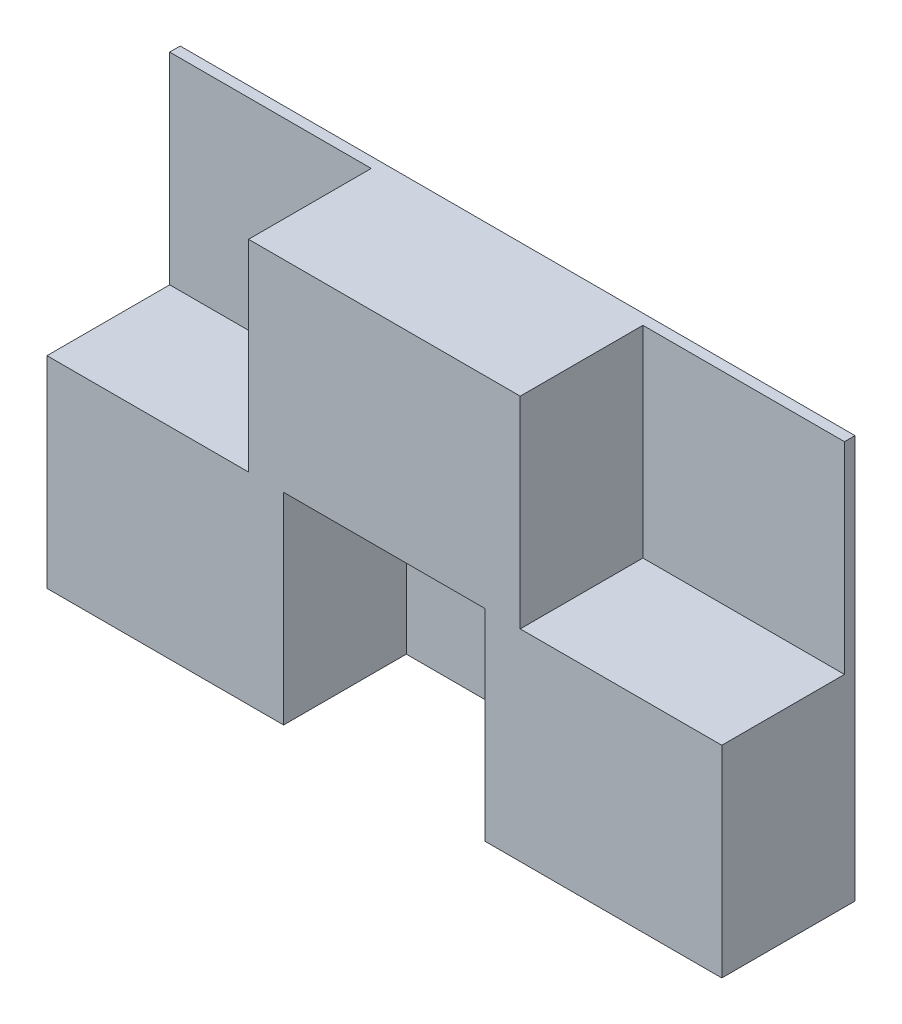
ISO-10303-21;
HEADER;
FILE_DESCRIPTION(('STEP AP214'),'2;1');
FILE_NAME('part.step','',(''),(''),'','','');
FILE_SCHEMA(('AUTOMOTIVE_DESIGN { 1 0 10303 214 1 1 1 1 }'));
ENDSEC;
DATA;
#1=APPLICATION_CONTEXT('core data for automotive mechanical design processes');
#2=APPLICATION_PROTOCOL_DEFINITION('international standard','automotive_design',2000,#1);
#3=PRODUCT_CONTEXT('',#1,'mechanical');
#4=PRODUCT('Part','Part','',(#3));
#5=PRODUCT_RELATED_PRODUCT_CATEGORY('part','',(#4));
#6=PRODUCT_DEFINITION_FORMATION('','',#4);
#7=PRODUCT_DEFINITION_CONTEXT('part definition',#1,'design');
#8=PRODUCT_DEFINITION('design','',#6,#7);
#9=PRODUCT_DEFINITION_SHAPE('','',#8);
#10=(LENGTH_UNIT() NAMED_UNIT(*) SI_UNIT(.MILLI.,.METRE.));
#11=(NAMED_UNIT(*) PLANE_ANGLE_UNIT() SI_UNIT($,.RADIAN.));
#12=(NAMED_UNIT(*) SI_UNIT($,.STERADIAN.) SOLID_ANGLE_UNIT());
#13=UNCERTAINTY_MEASURE_WITH_UNIT(LENGTH_MEASURE(1.E-05),#10,'distance_accuracy_value','');
#14=(GEOMETRIC_REPRESENTATION_CONTEXT(3) GLOBAL_UNCERTAINTY_ASSIGNED_CONTEXT((#13)) GLOBAL_UNIT_ASSIGNED_CONTEXT((#10,
#11,#12)) REPRESENTATION_CONTEXT('',''));
#15=CARTESIAN_POINT('',(0.,0.,0.));
#16=DIRECTION('',(0.,0.,1.));
#17=DIRECTION('',(1.,0.,0.));
#18=AXIS2_PLACEMENT_3D('',#15,#16,#17);
#19=CARTESIAN_POINT('',(0.,0.,3.));
#20=DIRECTION('',(0.,0.,-1.));
#21=DIRECTION('',(-1.,0.,0.));
#22=AXIS2_PLACEMENT_3D('',#19,#20,#21);
#23=PLANE('',#22);
#24=DIRECTION('',(-1.,0.,0.));
#25=VECTOR('',#24,1.);
#26=CARTESIAN_POINT('',(0.,57.5,3.));
#27=LINE('',#26,#25);
#28=CARTESIAN_POINT('',(57.5,57.5,3.));
#29=VERTEX_POINT('',#28);
#30=CARTESIAN_POINT('',(0.,57.5,3.));
#31=VERTEX_POINT('',#30);
#32=EDGE_CURVE('E50',#29,#31,#27,.T.);
#33=ORIENTED_EDGE('',*,*,#32,.F.);
#34=DIRECTION('',(0.,-1.,0.));
#35=VECTOR('',#34,1.);
#36=CARTESIAN_POINT('',(57.5,57.5,3.));
#37=LINE('',#36,#35);
#38=CARTESIAN_POINT('',(57.5,115.,3.));
#39=VERTEX_POINT('',#38);
#40=EDGE_CURVE('E154',#39,#29,#37,.T.);
#41=ORIENTED_EDGE('',*,*,#40,.F.);
#42=DIRECTION('',(-1.,0.,0.));
#43=VECTOR('',#42,1.);
#44=CARTESIAN_POINT('',(0.,115.,3.));
#45=LINE('',#44,#43);
#46=CARTESIAN_POINT('',(0.,115.,3.));
#47=VERTEX_POINT('',#46);
#48=EDGE_CURVE('E244',#39,#47,#45,.T.);
#49=ORIENTED_EDGE('',*,*,#48,.T.);
#50=DIRECTION('',(0.,-1.,0.));
#51=VECTOR('',#50,1.);
#52=CARTESIAN_POINT('',(0.,0.,3.));
#53=LINE('',#52,#51);
#54=EDGE_CURVE('E236',#47,#31,#53,.T.);
#55=ORIENTED_EDGE('',*,*,#54,.T.);
#56=EDGE_LOOP('',(#33,#41,#49,#55));
#57=FACE_BOUND('',#56,.T.);
#58=ADVANCED_FACE('F33',(#57),#23,.F.);
#59=DIRECTION('',(0.,1.,0.));
#60=VECTOR('',#59,1.);
#61=CARTESIAN_POINT('',(135.,115.,3.));
#62=LINE('',#61,#60);
#63=CARTESIAN_POINT('',(135.,57.5,3.));
#64=VERTEX_POINT('',#63);
#65=CARTESIAN_POINT('',(135.,115.,3.));
#66=VERTEX_POINT('',#65);
#67=EDGE_CURVE('E58',#64,#66,#62,.T.);
#68=ORIENTED_EDGE('',*,*,#67,.F.);
#69=DIRECTION('',(-1.,0.,0.));
#70=VECTOR('',#69,1.);
#71=CARTESIAN_POINT('',(192.5,57.5,3.));
#72=LINE('',#71,#70);
#73=CARTESIAN_POINT('',(192.5,57.5,3.));
#74=VERTEX_POINT('',#73);
#75=EDGE_CURVE('E189',#74,#64,#72,.T.);
#76=ORIENTED_EDGE('',*,*,#75,.F.);
#77=DIRECTION('',(0.,1.,0.));
#78=VECTOR('',#77,1.);
#79=CARTESIAN_POINT('',(192.5,0.,3.));
#80=LINE('',#79,#78);
#81=CARTESIAN_POINT('',(192.5,115.,3.));
#82=VERTEX_POINT('',#81);
#83=EDGE_CURVE('E242',#74,#82,#80,.T.);
#84=ORIENTED_EDGE('',*,*,#83,.T.);
#85=EDGE_CURVE('E245',#82,#66,#45,.T.);
#86=ORIENTED_EDGE('',*,*,#85,.T.);
#87=EDGE_LOOP('',(#68,#76,#84,#86));
#88=FACE_BOUND('',#87,.T.);
#89=ADVANCED_FACE('F320',(#88),#23,.F.);
#90=DIRECTION('',(0.,-1.,0.));
#91=VECTOR('',#90,1.);
#92=CARTESIAN_POINT('',(125.,57.5,3.));
#93=LINE('',#92,#91);
#94=CARTESIAN_POINT('',(125.,57.5,3.));
#95=VERTEX_POINT('',#94);
#96=CARTESIAN_POINT('',(125.,0.,3.));
#97=VERTEX_POINT('',#96);
#98=EDGE_CURVE('E181',#95,#97,#93,.T.);
#99=ORIENTED_EDGE('',*,*,#98,.F.);
#100=DIRECTION('',(1.,0.,0.));
#101=VECTOR('',#100,1.);
#102=CARTESIAN_POINT('',(67.5,57.5,3.));
#103=LINE('',#102,#101);
#104=CARTESIAN_POINT('',(67.5,57.5,3.));
#105=VERTEX_POINT('',#104);
#106=EDGE_CURVE('E178',#105,#95,#103,.T.);
#107=ORIENTED_EDGE('',*,*,#106,.F.);
#108=DIRECTION('',(0.,1.,0.));
#109=VECTOR('',#108,1.);
#110=CARTESIAN_POINT('',(67.5,57.5,3.));
#111=LINE('',#110,#109);
#112=CARTESIAN_POINT('',(67.5,0.,3.));
#113=VERTEX_POINT('',#112);
#114=EDGE_CURVE('E172',#113,#105,#111,.T.);
#115=ORIENTED_EDGE('',*,*,#114,.F.);
#116=DIRECTION('',(1.,0.,0.));
#117=VECTOR('',#116,1.);
#118=CARTESIAN_POINT('',(0.,0.,3.));
#119=LINE('',#118,#117);
#120=EDGE_CURVE('E238',#113,#97,#119,.T.);
#121=ORIENTED_EDGE('',*,*,#120,.T.);
#122=EDGE_LOOP('',(#99,#107,#115,#121));
#123=FACE_BOUND('',#122,.T.);
#124=ADVANCED_FACE('F311',(#123),#23,.F.);
#125=CARTESIAN_POINT('',(0.,0.,3.));
#126=DIRECTION('',(1.,0.,0.));
#127=DIRECTION('',(0.,0.,-1.));
#128=AXIS2_PLACEMENT_3D('',#125,#126,#127);
#129=PLANE('',#128);
#130=DIRECTION('',(0.,-1.,0.));
#131=VECTOR('',#130,1.);
#132=CARTESIAN_POINT('',(0.,0.,0.));
#133=LINE('',#132,#131);
#134=CARTESIAN_POINT('',(0.,115.,0.));
#135=VERTEX_POINT('',#134);
#136=CARTESIAN_POINT('',(0.,0.,0.));
#137=VERTEX_POINT('',#136);
#138=EDGE_CURVE('E157',#135,#137,#133,.T.);
#139=ORIENTED_EDGE('',*,*,#138,.T.);
#140=DIRECTION('',(0.,0.,-1.));
#141=VECTOR('',#140,1.);
#142=CARTESIAN_POINT('',(0.,0.,3.));
#143=LINE('',#142,#141);
#144=CARTESIAN_POINT('',(0.,0.,38.));
#145=VERTEX_POINT('',#144);
#146=EDGE_CURVE('E11',#145,#137,#143,.T.);
#147=ORIENTED_EDGE('',*,*,#146,.F.);
#148=DIRECTION('',(0.,-1.,0.));
#149=VECTOR('',#148,1.);
#150=CARTESIAN_POINT('',(0.,57.5,38.));
#151=LINE('',#150,#149);
#152=CARTESIAN_POINT('',(0.,57.5,38.));
#153=VERTEX_POINT('',#152);
#154=EDGE_CURVE('E136',#153,#145,#151,.T.);
#155=ORIENTED_EDGE('',*,*,#154,.F.);
#156=DIRECTION('',(0.,0.,-1.));
#157=VECTOR('',#156,1.);
#158=CARTESIAN_POINT('',(0.,57.5,38.));
#159=LINE('',#158,#157);
#160=EDGE_CURVE('E141',#153,#31,#159,.T.);
#161=ORIENTED_EDGE('',*,*,#160,.T.);
#162=ORIENTED_EDGE('',*,*,#54,.F.);
#163=DIRECTION('',(0.,0.,-1.));
#164=VECTOR('',#163,1.);
#165=CARTESIAN_POINT('',(0.,115.,3.));
#166=LINE('',#165,#164);
#167=EDGE_CURVE('E292',#47,#135,#166,.T.);
#168=ORIENTED_EDGE('',*,*,#167,.T.);
#169=EDGE_LOOP('',(#139,#147,#155,#161,#162,#168));
#170=FACE_BOUND('',#169,.T.);
#171=ADVANCED_FACE('F35',(#170),#129,.F.);
#172=CARTESIAN_POINT('',(0.,0.,3.));
#173=DIRECTION('',(0.,1.,0.));
#174=DIRECTION('',(0.,0.,1.));
#175=AXIS2_PLACEMENT_3D('',#172,#173,#174);
#176=PLANE('',#175);
#177=DIRECTION('',(1.,0.,0.));
#178=VECTOR('',#177,1.);
#179=CARTESIAN_POINT('',(0.,0.,0.));
#180=LINE('',#179,#178);
#181=CARTESIAN_POINT('',(192.5,0.,0.));
#182=VERTEX_POINT('',#181);
#183=EDGE_CURVE('E160',#137,#182,#180,.T.);
#184=ORIENTED_EDGE('',*,*,#183,.T.);
#185=DIRECTION('',(0.,0.,-1.));
#186=VECTOR('',#185,1.);
#187=CARTESIAN_POINT('',(192.5,0.,3.));
#188=LINE('',#187,#186);
#189=CARTESIAN_POINT('',(192.5,0.,38.));
#190=VERTEX_POINT('',#189);
#191=EDGE_CURVE('E42',#190,#182,#188,.T.);
#192=ORIENTED_EDGE('',*,*,#191,.F.);
#193=DIRECTION('',(1.,0.,0.));
#194=VECTOR('',#193,1.);
#195=CARTESIAN_POINT('',(192.5,0.,38.));
#196=LINE('',#195,#194);
#197=CARTESIAN_POINT('',(125.,0.,38.));
#198=VERTEX_POINT('',#197);
#199=EDGE_CURVE('E271',#198,#190,#196,.T.);
#200=ORIENTED_EDGE('',*,*,#199,.F.);
#201=DIRECTION('',(0.,0.,-1.));
#202=VECTOR('',#201,1.);
#203=CARTESIAN_POINT('',(125.,0.,38.));
#204=LINE('',#203,#202);
#205=EDGE_CURVE('E192',#198,#97,#204,.T.);
#206=ORIENTED_EDGE('',*,*,#205,.T.);
#207=ORIENTED_EDGE('',*,*,#120,.F.);
#208=DIRECTION('',(0.,0.,-1.));
#209=VECTOR('',#208,1.);
#210=CARTESIAN_POINT('',(67.5,0.,38.));
#211=LINE('',#210,#209);
#212=CARTESIAN_POINT('',(67.5,0.,38.));
#213=VERTEX_POINT('',#212);
#214=EDGE_CURVE('E158',#213,#113,#211,.T.);
#215=ORIENTED_EDGE('',*,*,#214,.F.);
#216=DIRECTION('',(1.,0.,0.));
#217=VECTOR('',#216,1.);
#218=CARTESIAN_POINT('',(0.,0.,38.));
#219=LINE('',#218,#217);
#220=EDGE_CURVE('E144',#145,#213,#219,.T.);
#221=ORIENTED_EDGE('',*,*,#220,.F.);
#222=ORIENTED_EDGE('',*,*,#146,.T.);
#223=EDGE_LOOP('',(#184,#192,#200,#206,#207,#215,#221,#222));
#224=FACE_BOUND('',#223,.T.);
#225=ADVANCED_FACE('F310',(#224),#176,.F.);
#226=CARTESIAN_POINT('',(192.5,0.,3.));
#227=DIRECTION('',(-1.,0.,0.));
#228=DIRECTION('',(0.,0.,1.));
#229=AXIS2_PLACEMENT_3D('',#226,#227,#228);
#230=PLANE('',#229);
#231=DIRECTION('',(0.,1.,0.));
#232=VECTOR('',#231,1.);
#233=CARTESIAN_POINT('',(192.5,0.,0.));
#234=LINE('',#233,#232);
#235=CARTESIAN_POINT('',(192.5,115.,0.));
#236=VERTEX_POINT('',#235);
#237=EDGE_CURVE('E307',#182,#236,#234,.T.);
#238=ORIENTED_EDGE('',*,*,#237,.T.);
#239=DIRECTION('',(0.,0.,-1.));
#240=VECTOR('',#239,1.);
#241=CARTESIAN_POINT('',(192.5,115.,3.));
#242=LINE('',#241,#240);
#243=EDGE_CURVE('E296',#82,#236,#242,.T.);
#244=ORIENTED_EDGE('',*,*,#243,.F.);
#245=ORIENTED_EDGE('',*,*,#83,.F.);
#246=DIRECTION('',(0.,0.,-1.));
#247=VECTOR('',#246,1.);
#248=CARTESIAN_POINT('',(192.5,57.5,38.));
#249=LINE('',#248,#247);
#250=CARTESIAN_POINT('',(192.5,57.5,38.));
#251=VERTEX_POINT('',#250);
#252=EDGE_CURVE('E195',#251,#74,#249,.T.);
#253=ORIENTED_EDGE('',*,*,#252,.F.);
#254=DIRECTION('',(0.,1.,0.));
#255=VECTOR('',#254,1.);
#256=CARTESIAN_POINT('',(192.5,57.5,38.));
#257=LINE('',#256,#255);
#258=EDGE_CURVE('E278',#190,#251,#257,.T.);
#259=ORIENTED_EDGE('',*,*,#258,.F.);
#260=ORIENTED_EDGE('',*,*,#191,.T.);
#261=EDGE_LOOP('',(#238,#244,#245,#253,#259,#260));
#262=FACE_BOUND('',#261,.T.);
#263=ADVANCED_FACE('F305',(#262),#230,.F.);
#264=CARTESIAN_POINT('',(0.,115.,3.));
#265=DIRECTION('',(0.,-1.,0.));
#266=DIRECTION('',(0.,0.,-1.));
#267=AXIS2_PLACEMENT_3D('',#264,#265,#266);
#268=PLANE('',#267);
#269=DIRECTION('',(-1.,0.,0.));
#270=VECTOR('',#269,1.);
#271=CARTESIAN_POINT('',(0.,115.,0.));
#272=LINE('',#271,#270);
#273=EDGE_CURVE('E239',#236,#135,#272,.T.);
#274=ORIENTED_EDGE('',*,*,#273,.T.);
#275=ORIENTED_EDGE('',*,*,#167,.F.);
#276=ORIENTED_EDGE('',*,*,#48,.F.);
#277=DIRECTION('',(0.,0.,-1.));
#278=VECTOR('',#277,1.);
#279=CARTESIAN_POINT('',(57.5,115.,38.));
#280=LINE('',#279,#278);
#281=CARTESIAN_POINT('',(57.5,115.,38.));
#282=VERTEX_POINT('',#281);
#283=EDGE_CURVE('E218',#282,#39,#280,.T.);
#284=ORIENTED_EDGE('',*,*,#283,.F.);
#285=DIRECTION('',(-1.,0.,0.));
#286=VECTOR('',#285,1.);
#287=CARTESIAN_POINT('',(57.5,115.,38.));
#288=LINE('',#287,#286);
#289=CARTESIAN_POINT('',(135.,115.,38.));
#290=VERTEX_POINT('',#289);
#291=EDGE_CURVE('E227',#290,#282,#288,.T.);
#292=ORIENTED_EDGE('',*,*,#291,.F.);
#293=DIRECTION('',(0.,0.,-1.));
#294=VECTOR('',#293,1.);
#295=CARTESIAN_POINT('',(135.,115.,38.));
#296=LINE('',#295,#294);
#297=EDGE_CURVE('E208',#290,#66,#296,.T.);
#298=ORIENTED_EDGE('',*,*,#297,.T.);
#299=ORIENTED_EDGE('',*,*,#85,.F.);
#300=ORIENTED_EDGE('',*,*,#243,.T.);
#301=EDGE_LOOP('',(#274,#275,#276,#284,#292,#298,#299,#300));
#302=FACE_BOUND('',#301,.T.);
#303=ADVANCED_FACE('F288',(#302),#268,.F.);
#304=CARTESIAN_POINT('',(0.,0.,0.));
#305=DIRECTION('',(0.,0.,-1.));
#306=DIRECTION('',(-1.,0.,0.));
#307=AXIS2_PLACEMENT_3D('',#304,#305,#306);
#308=PLANE('',#307);
#309=ORIENTED_EDGE('',*,*,#138,.F.);
#310=ORIENTED_EDGE('',*,*,#273,.F.);
#311=ORIENTED_EDGE('',*,*,#237,.F.);
#312=ORIENTED_EDGE('',*,*,#183,.F.);
#313=EDGE_LOOP('',(#309,#310,#311,#312));
#314=FACE_BOUND('',#313,.T.);
#315=ADVANCED_FACE('F309',(#314),#308,.T.);
#316=CARTESIAN_POINT('',(0.,57.5,38.));
#317=DIRECTION('',(0.,-1.,0.));
#318=DIRECTION('',(0.,0.,-1.));
#319=AXIS2_PLACEMENT_3D('',#316,#317,#318);
#320=PLANE('',#319);
#321=ORIENTED_EDGE('',*,*,#32,.T.);
#322=ORIENTED_EDGE('',*,*,#160,.F.);
#323=DIRECTION('',(-1.,0.,0.));
#324=VECTOR('',#323,1.);
#325=CARTESIAN_POINT('',(0.,57.5,38.));
#326=LINE('',#325,#324);
#327=CARTESIAN_POINT('',(57.5,57.5,38.));
#328=VERTEX_POINT('',#327);
#329=EDGE_CURVE('E145',#328,#153,#326,.T.);
#330=ORIENTED_EDGE('',*,*,#329,.F.);
#331=DIRECTION('',(0.,0.,-1.));
#332=VECTOR('',#331,1.);
#333=CARTESIAN_POINT('',(57.5,57.5,38.));
#334=LINE('',#333,#332);
#335=EDGE_CURVE('E223',#328,#29,#334,.T.);
#336=ORIENTED_EDGE('',*,*,#335,.T.);
#337=EDGE_LOOP('',(#321,#322,#330,#336));
#338=FACE_BOUND('',#337,.T.);
#339=ADVANCED_FACE('F156',(#338),#320,.F.);
#340=CARTESIAN_POINT('',(67.5,57.5,38.));
#341=DIRECTION('',(-1.,0.,0.));
#342=DIRECTION('',(0.,-1.,0.));
#343=AXIS2_PLACEMENT_3D('',#340,#341,#342);
#344=PLANE('',#343);
#345=ORIENTED_EDGE('',*,*,#114,.T.);
#346=DIRECTION('',(0.,0.,-1.));
#347=VECTOR('',#346,1.);
#348=CARTESIAN_POINT('',(67.5,57.5,38.));
#349=LINE('',#348,#347);
#350=CARTESIAN_POINT('',(67.5,57.5,38.));
#351=VERTEX_POINT('',#350);
#352=EDGE_CURVE('E163',#351,#105,#349,.T.);
#353=ORIENTED_EDGE('',*,*,#352,.F.);
#354=DIRECTION('',(0.,1.,0.));
#355=VECTOR('',#354,1.);
#356=CARTESIAN_POINT('',(67.5,57.5,38.));
#357=LINE('',#356,#355);
#358=EDGE_CURVE('E269',#213,#351,#357,.T.);
#359=ORIENTED_EDGE('',*,*,#358,.F.);
#360=ORIENTED_EDGE('',*,*,#214,.T.);
#361=EDGE_LOOP('',(#345,#353,#359,#360));
#362=FACE_BOUND('',#361,.T.);
#363=ADVANCED_FACE('F258',(#362),#344,.F.);
#364=CARTESIAN_POINT('',(67.5,57.5,38.));
#365=DIRECTION('',(0.,1.,0.));
#366=DIRECTION('',(0.,0.,1.));
#367=AXIS2_PLACEMENT_3D('',#364,#365,#366);
#368=PLANE('',#367);
#369=ORIENTED_EDGE('',*,*,#106,.T.);
#370=DIRECTION('',(0.,0.,-1.));
#371=VECTOR('',#370,1.);
#372=CARTESIAN_POINT('',(125.,57.5,38.));
#373=LINE('',#372,#371);
#374=CARTESIAN_POINT('',(125.,57.5,38.));
#375=VERTEX_POINT('',#374);
#376=EDGE_CURVE('E194',#375,#95,#373,.T.);
#377=ORIENTED_EDGE('',*,*,#376,.F.);
#378=DIRECTION('',(1.,0.,0.));
#379=VECTOR('',#378,1.);
#380=CARTESIAN_POINT('',(67.5,57.5,38.));
#381=LINE('',#380,#379);
#382=EDGE_CURVE('E266',#351,#375,#381,.T.);
#383=ORIENTED_EDGE('',*,*,#382,.F.);
#384=ORIENTED_EDGE('',*,*,#352,.T.);
#385=EDGE_LOOP('',(#369,#377,#383,#384));
#386=FACE_BOUND('',#385,.T.);
#387=ADVANCED_FACE('F264',(#386),#368,.F.);
#388=CARTESIAN_POINT('',(125.,57.5,38.));
#389=DIRECTION('',(1.,0.,0.));
#390=DIRECTION('',(0.,0.,-1.));
#391=AXIS2_PLACEMENT_3D('',#388,#389,#390);
#392=PLANE('',#391);
#393=ORIENTED_EDGE('',*,*,#98,.T.);
#394=ORIENTED_EDGE('',*,*,#205,.F.);
#395=DIRECTION('',(0.,-1.,0.));
#396=VECTOR('',#395,1.);
#397=CARTESIAN_POINT('',(125.,57.5,38.));
#398=LINE('',#397,#396);
#399=EDGE_CURVE('E268',#375,#198,#398,.T.);
#400=ORIENTED_EDGE('',*,*,#399,.F.);
#401=ORIENTED_EDGE('',*,*,#376,.T.);
#402=EDGE_LOOP('',(#393,#394,#400,#401));
#403=FACE_BOUND('',#402,.T.);
#404=ADVANCED_FACE('F313',(#403),#392,.F.);
#405=CARTESIAN_POINT('',(192.5,57.5,38.));
#406=DIRECTION('',(0.,-1.,0.));
#407=DIRECTION('',(0.,0.,-1.));
#408=AXIS2_PLACEMENT_3D('',#405,#406,#407);
#409=PLANE('',#408);
#410=ORIENTED_EDGE('',*,*,#75,.T.);
#411=DIRECTION('',(0.,0.,-1.));
#412=VECTOR('',#411,1.);
#413=CARTESIAN_POINT('',(135.,57.5,38.));
#414=LINE('',#413,#412);
#415=CARTESIAN_POINT('',(135.,57.5,38.));
#416=VERTEX_POINT('',#415);
#417=EDGE_CURVE('E203',#416,#64,#414,.T.);
#418=ORIENTED_EDGE('',*,*,#417,.F.);
#419=DIRECTION('',(-1.,0.,0.));
#420=VECTOR('',#419,1.);
#421=CARTESIAN_POINT('',(192.5,57.5,38.));
#422=LINE('',#421,#420);
#423=EDGE_CURVE('E280',#251,#416,#422,.T.);
#424=ORIENTED_EDGE('',*,*,#423,.F.);
#425=ORIENTED_EDGE('',*,*,#252,.T.);
#426=EDGE_LOOP('',(#410,#418,#424,#425));
#427=FACE_BOUND('',#426,.T.);
#428=ADVANCED_FACE('F316',(#427),#409,.F.);
#429=CARTESIAN_POINT('',(135.,115.,38.));
#430=DIRECTION('',(-1.,0.,0.));
#431=DIRECTION('',(0.,0.,1.));
#432=AXIS2_PLACEMENT_3D('',#429,#430,#431);
#433=PLANE('',#432);
#434=ORIENTED_EDGE('',*,*,#67,.T.);
#435=ORIENTED_EDGE('',*,*,#297,.F.);
#436=DIRECTION('',(0.,1.,0.));
#437=VECTOR('',#436,1.);
#438=CARTESIAN_POINT('',(135.,115.,38.));
#439=LINE('',#438,#437);
#440=EDGE_CURVE('E282',#416,#290,#439,.T.);
#441=ORIENTED_EDGE('',*,*,#440,.F.);
#442=ORIENTED_EDGE('',*,*,#417,.T.);
#443=EDGE_LOOP('',(#434,#435,#441,#442));
#444=FACE_BOUND('',#443,.T.);
#445=ADVANCED_FACE('F318',(#444),#433,.F.);
#446=CARTESIAN_POINT('',(57.5,57.5,38.));
#447=DIRECTION('',(1.,0.,0.));
#448=DIRECTION('',(0.,0.,-1.));
#449=AXIS2_PLACEMENT_3D('',#446,#447,#448);
#450=PLANE('',#449);
#451=ORIENTED_EDGE('',*,*,#40,.T.);
#452=ORIENTED_EDGE('',*,*,#335,.F.);
#453=DIRECTION('',(0.,-1.,0.));
#454=VECTOR('',#453,1.);
#455=CARTESIAN_POINT('',(57.5,57.5,38.));
#456=LINE('',#455,#454);
#457=EDGE_CURVE('E150',#282,#328,#456,.T.);
#458=ORIENTED_EDGE('',*,*,#457,.F.);
#459=ORIENTED_EDGE('',*,*,#283,.T.);
#460=EDGE_LOOP('',(#451,#452,#458,#459));
#461=FACE_BOUND('',#460,.T.);
#462=ADVANCED_FACE('F290',(#461),#450,.F.);
#463=CARTESIAN_POINT('',(0.,0.,38.));
#464=DIRECTION('',(0.,0.,1.));
#465=DIRECTION('',(1.,0.,0.));
#466=AXIS2_PLACEMENT_3D('',#463,#464,#465);
#467=PLANE('',#466);
#468=ORIENTED_EDGE('',*,*,#329,.T.);
#469=ORIENTED_EDGE('',*,*,#154,.T.);
#470=ORIENTED_EDGE('',*,*,#220,.T.);
#471=ORIENTED_EDGE('',*,*,#358,.T.);
#472=ORIENTED_EDGE('',*,*,#382,.T.);
#473=ORIENTED_EDGE('',*,*,#399,.T.);
#474=ORIENTED_EDGE('',*,*,#199,.T.);
#475=ORIENTED_EDGE('',*,*,#258,.T.);
#476=ORIENTED_EDGE('',*,*,#423,.T.);
#477=ORIENTED_EDGE('',*,*,#440,.T.);
#478=ORIENTED_EDGE('',*,*,#291,.T.);
#479=ORIENTED_EDGE('',*,*,#457,.T.);
#480=EDGE_LOOP('',(#468,#469,#470,#471,#472,#473,#474,#475,#476,#477,#478,#479));
#481=FACE_BOUND('',#480,.T.);
#482=ADVANCED_FACE('F148',(#481),#467,.T.);
#483=CLOSED_SHELL('',(#58,#89,#124,#171,#225,#263,#303,#315,#339,#363,#387,#404,#428,#445,#462,#482));
#484=MANIFOLD_SOLID_BREP('B2',#483);
#485=ADVANCED_BREP_SHAPE_REPRESENTATION('',(#18,#484),#14);
#486=SHAPE_DEFINITION_REPRESENTATION(#9,#485);
ENDSEC;
END-ISO-10303-21;
